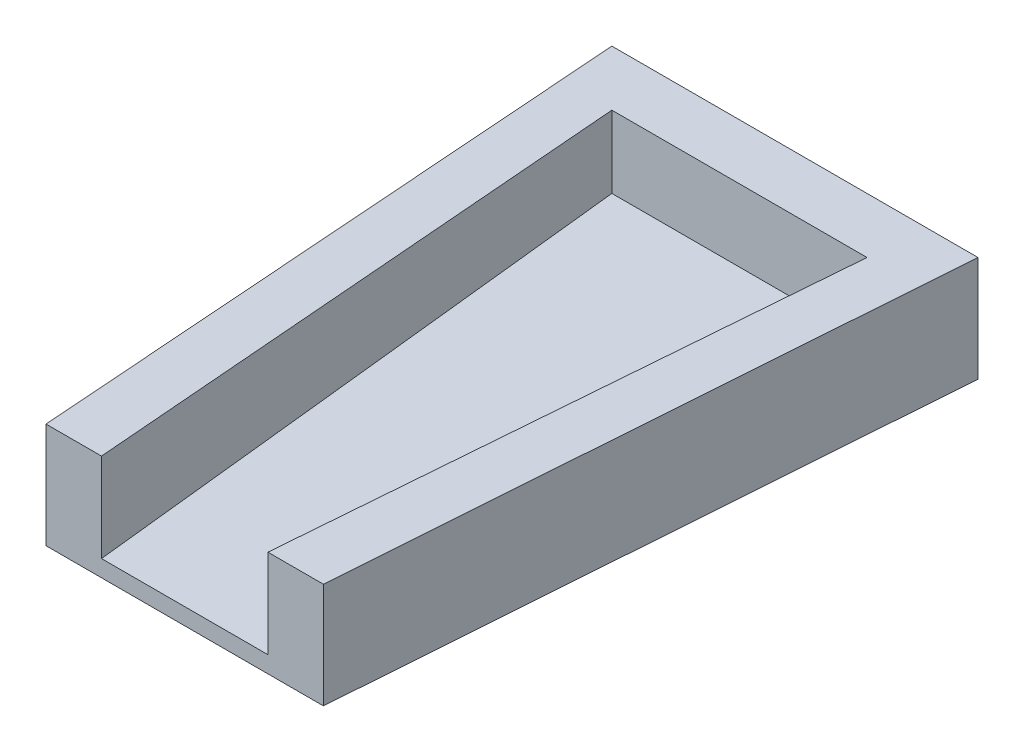
ISO-10303-21;
HEADER;
FILE_DESCRIPTION(('STEP AP214'),'2;1');
FILE_NAME('part.step','',(''),(''),'','','');
FILE_SCHEMA(('AUTOMOTIVE_DESIGN { 1 0 10303 214 1 1 1 1 }'));
ENDSEC;
DATA;
#1=APPLICATION_CONTEXT('core data for automotive mechanical design processes');
#2=APPLICATION_PROTOCOL_DEFINITION('international standard','automotive_design',2000,#1);
#3=PRODUCT_CONTEXT('',#1,'mechanical');
#4=PRODUCT('Part','Part','',(#3));
#5=PRODUCT_RELATED_PRODUCT_CATEGORY('part','',(#4));
#6=PRODUCT_DEFINITION_FORMATION('','',#4);
#7=PRODUCT_DEFINITION_CONTEXT('part definition',#1,'design');
#8=PRODUCT_DEFINITION('design','',#6,#7);
#9=PRODUCT_DEFINITION_SHAPE('','',#8);
#10=(LENGTH_UNIT() NAMED_UNIT(*) SI_UNIT(.MILLI.,.METRE.));
#11=(NAMED_UNIT(*) PLANE_ANGLE_UNIT() SI_UNIT($,.RADIAN.));
#12=(NAMED_UNIT(*) SI_UNIT($,.STERADIAN.) SOLID_ANGLE_UNIT());
#13=UNCERTAINTY_MEASURE_WITH_UNIT(LENGTH_MEASURE(1.E-05),#10,'distance_accuracy_value','');
#14=(GEOMETRIC_REPRESENTATION_CONTEXT(3) GLOBAL_UNCERTAINTY_ASSIGNED_CONTEXT((#13)) GLOBAL_UNIT_ASSIGNED_CONTEXT((#10,
#11,#12)) REPRESENTATION_CONTEXT('',''));
#15=CARTESIAN_POINT('',(0.,0.,0.));
#16=DIRECTION('',(0.,0.,1.));
#17=DIRECTION('',(1.,0.,0.));
#18=AXIS2_PLACEMENT_3D('',#15,#16,#17);
#19=CARTESIAN_POINT('',(0.,0.,11.));
#20=DIRECTION('',(0.,0.,-1.));
#21=DIRECTION('',(-1.,0.,0.));
#22=AXIS2_PLACEMENT_3D('',#19,#20,#21);
#23=PLANE('',#22);
#24=DIRECTION('',(-1.,0.,0.));
#25=VECTOR('',#24,1.);
#26=CARTESIAN_POINT('',(0.,0.,11.));
#27=LINE('',#26,#25);
#28=CARTESIAN_POINT('',(2.5,0.,11.));
#29=VERTEX_POINT('',#28);
#30=CARTESIAN_POINT('',(1.5,0.,11.));
#31=VERTEX_POINT('',#30);
#32=EDGE_CURVE('E157',#29,#31,#27,.T.);
#33=ORIENTED_EDGE('',*,*,#32,.T.);
#34=DIRECTION('',(0.,1.,0.));
#35=VECTOR('',#34,1.);
#36=CARTESIAN_POINT('',(1.5,-1.6,11.));
#37=LINE('',#36,#35);
#38=CARTESIAN_POINT('',(1.5,-1.6,11.));
#39=VERTEX_POINT('',#38);
#40=EDGE_CURVE('E132',#39,#31,#37,.T.);
#41=ORIENTED_EDGE('',*,*,#40,.F.);
#42=DIRECTION('',(1.,0.,0.));
#43=VECTOR('',#42,1.);
#44=CARTESIAN_POINT('',(-1.5,-1.6,11.));
#45=LINE('',#44,#43);
#46=CARTESIAN_POINT('',(-1.5,-1.6,11.));
#47=VERTEX_POINT('',#46);
#48=EDGE_CURVE('E131',#47,#39,#45,.T.);
#49=ORIENTED_EDGE('',*,*,#48,.F.);
#50=DIRECTION('',(0.,-1.,0.));
#51=VECTOR('',#50,1.);
#52=CARTESIAN_POINT('',(-1.5,-1.6,11.));
#53=LINE('',#52,#51);
#54=CARTESIAN_POINT('',(-1.5,0.,11.));
#55=VERTEX_POINT('',#54);
#56=EDGE_CURVE('E122',#55,#47,#53,.T.);
#57=ORIENTED_EDGE('',*,*,#56,.F.);
#58=CARTESIAN_POINT('',(-2.5,0.,11.));
#59=VERTEX_POINT('',#58);
#60=EDGE_CURVE('E164',#55,#59,#27,.T.);
#61=ORIENTED_EDGE('',*,*,#60,.T.);
#62=DIRECTION('',(0.,-1.,0.));
#63=VECTOR('',#62,1.);
#64=CARTESIAN_POINT('',(-2.5,-1.9,11.));
#65=LINE('',#64,#63);
#66=CARTESIAN_POINT('',(-2.5,-1.9,11.));
#67=VERTEX_POINT('',#66);
#68=EDGE_CURVE('E294',#59,#67,#65,.T.);
#69=ORIENTED_EDGE('',*,*,#68,.T.);
#70=DIRECTION('',(1.,0.,0.));
#71=VECTOR('',#70,1.);
#72=CARTESIAN_POINT('',(-2.5,-1.9,11.));
#73=LINE('',#72,#71);
#74=CARTESIAN_POINT('',(2.5,-1.9,11.));
#75=VERTEX_POINT('',#74);
#76=EDGE_CURVE('E290',#67,#75,#73,.T.);
#77=ORIENTED_EDGE('',*,*,#76,.T.);
#78=DIRECTION('',(0.,1.,0.));
#79=VECTOR('',#78,1.);
#80=CARTESIAN_POINT('',(2.5,-1.9,11.));
#81=LINE('',#80,#79);
#82=EDGE_CURVE('E161',#75,#29,#81,.T.);
#83=ORIENTED_EDGE('',*,*,#82,.T.);
#84=EDGE_LOOP('',(#33,#41,#49,#57,#61,#69,#77,#83));
#85=FACE_BOUND('',#84,.T.);
#86=ADVANCED_FACE('F55',(#85),#23,.F.);
#87=CARTESIAN_POINT('',(0.,0.,0.));
#88=DIRECTION('',(0.,0.,-1.));
#89=DIRECTION('',(-1.,0.,0.));
#90=AXIS2_PLACEMENT_3D('',#87,#88,#89);
#91=PLANE('',#90);
#92=DIRECTION('',(-1.,0.,0.));
#93=VECTOR('',#92,1.);
#94=CARTESIAN_POINT('',(0.,0.,0.));
#95=LINE('',#94,#93);
#96=CARTESIAN_POINT('',(3.3,0.,0.));
#97=VERTEX_POINT('',#96);
#98=CARTESIAN_POINT('',(-3.3,0.,0.));
#99=VERTEX_POINT('',#98);
#100=EDGE_CURVE('E81',#97,#99,#95,.T.);
#101=ORIENTED_EDGE('',*,*,#100,.F.);
#102=DIRECTION('',(0.,1.,0.));
#103=VECTOR('',#102,1.);
#104=CARTESIAN_POINT('',(3.3,-1.9,0.));
#105=LINE('',#104,#103);
#106=CARTESIAN_POINT('',(3.3,-1.9,0.));
#107=VERTEX_POINT('',#106);
#108=EDGE_CURVE('E166',#107,#97,#105,.T.);
#109=ORIENTED_EDGE('',*,*,#108,.F.);
#110=DIRECTION('',(1.,0.,0.));
#111=VECTOR('',#110,1.);
#112=CARTESIAN_POINT('',(-3.3,-1.9,0.));
#113=LINE('',#112,#111);
#114=CARTESIAN_POINT('',(-3.3,-1.9,0.));
#115=VERTEX_POINT('',#114);
#116=EDGE_CURVE('E273',#115,#107,#113,.T.);
#117=ORIENTED_EDGE('',*,*,#116,.F.);
#118=DIRECTION('',(0.,-1.,0.));
#119=VECTOR('',#118,1.);
#120=CARTESIAN_POINT('',(-3.3,-1.9,0.));
#121=LINE('',#120,#119);
#122=EDGE_CURVE('E286',#99,#115,#121,.T.);
#123=ORIENTED_EDGE('',*,*,#122,.F.);
#124=EDGE_LOOP('',(#101,#109,#117,#123));
#125=FACE_BOUND('',#124,.T.);
#126=ADVANCED_FACE('F252',(#125),#91,.T.);
#127=CARTESIAN_POINT('',(3.28263729036501,0.,0.238737257481092));
#128=DIRECTION('',(-0.997365816958794,0.,-0.0725356957788214));
#129=DIRECTION('',(-0.0725356957788214,0.,0.997365816958794));
#130=AXIS2_PLACEMENT_3D('',#127,#128,#129);
#131=PLANE('',#130);
#132=ORIENTED_EDGE('',*,*,#108,.T.);
#133=DIRECTION('',(-0.0725356957788214,0.,0.997365816958794));
#134=VECTOR('',#133,1.);
#135=CARTESIAN_POINT('',(3.28263729036501,0.,0.238737257481092));
#136=LINE('',#135,#134);
#137=EDGE_CURVE('E163',#97,#29,#136,.T.);
#138=ORIENTED_EDGE('',*,*,#137,.T.);
#139=ORIENTED_EDGE('',*,*,#82,.F.);
#140=DIRECTION('',(-0.0725356957788214,0.,0.997365816958794));
#141=VECTOR('',#140,1.);
#142=CARTESIAN_POINT('',(3.3,-1.9,0.));
#143=LINE('',#142,#141);
#144=EDGE_CURVE('E371',#107,#75,#143,.T.);
#145=ORIENTED_EDGE('',*,*,#144,.F.);
#146=EDGE_LOOP('',(#132,#138,#139,#145));
#147=FACE_BOUND('',#146,.T.);
#148=ADVANCED_FACE('F256',(#147),#131,.F.);
#149=CARTESIAN_POINT('',(-3.28263729036501,0.,0.238737257481092));
#150=DIRECTION('',(0.997365816958794,0.,-0.0725356957788214));
#151=DIRECTION('',(-0.0725356957788214,0.,-0.997365816958794));
#152=AXIS2_PLACEMENT_3D('',#149,#150,#151);
#153=PLANE('',#152);
#154=ORIENTED_EDGE('',*,*,#68,.F.);
#155=DIRECTION('',(-0.0725356957788214,0.,-0.997365816958794));
#156=VECTOR('',#155,1.);
#157=CARTESIAN_POINT('',(-3.28263729036501,0.,0.238737257481092));
#158=LINE('',#157,#156);
#159=EDGE_CURVE('E181',#59,#99,#158,.T.);
#160=ORIENTED_EDGE('',*,*,#159,.T.);
#161=ORIENTED_EDGE('',*,*,#122,.T.);
#162=DIRECTION('',(0.0725356957788214,0.,0.997365816958794));
#163=VECTOR('',#162,1.);
#164=CARTESIAN_POINT('',(-3.3,-1.9,0.));
#165=LINE('',#164,#163);
#166=EDGE_CURVE('E374',#115,#67,#165,.T.);
#167=ORIENTED_EDGE('',*,*,#166,.T.);
#168=EDGE_LOOP('',(#154,#160,#161,#167));
#169=FACE_BOUND('',#168,.T.);
#170=ADVANCED_FACE('F336',(#169),#153,.F.);
#171=CARTESIAN_POINT('',(0.,-1.9,0.));
#172=DIRECTION('',(0.,1.,0.));
#173=DIRECTION('',(0.,0.,1.));
#174=AXIS2_PLACEMENT_3D('',#171,#172,#173);
#175=PLANE('',#174);
#176=ORIENTED_EDGE('',*,*,#144,.T.);
#177=ORIENTED_EDGE('',*,*,#76,.F.);
#178=ORIENTED_EDGE('',*,*,#166,.F.);
#179=ORIENTED_EDGE('',*,*,#116,.T.);
#180=EDGE_LOOP('',(#176,#177,#178,#179));
#181=FACE_BOUND('',#180,.T.);
#182=ADVANCED_FACE('F251',(#181),#175,.F.);
#183=CARTESIAN_POINT('',(-4.36182031470955,0.,-0.000100000000000054));
#184=DIRECTION('',(0.,-1.,0.));
#185=DIRECTION('',(0.,0.,-1.));
#186=AXIS2_PLACEMENT_3D('',#183,#184,#185);
#187=PLANE('',#186);
#188=DIRECTION('',(-1.,0.,0.));
#189=VECTOR('',#188,1.);
#190=CARTESIAN_POINT('',(-4.36182031470955,0.,1.));
#191=LINE('',#190,#189);
#192=CARTESIAN_POINT('',(2.3,0.,1.));
#193=VERTEX_POINT('',#192);
#194=CARTESIAN_POINT('',(-2.3,0.,1.));
#195=VERTEX_POINT('',#194);
#196=EDGE_CURVE('E64',#193,#195,#191,.T.);
#197=ORIENTED_EDGE('',*,*,#196,.F.);
#198=DIRECTION('',(-0.07974522228289,0.,0.996815278536125));
#199=VECTOR('',#198,1.);
#200=CARTESIAN_POINT('',(2.33713468798277,0.,0.535816400215386));
#201=LINE('',#200,#199);
#202=EDGE_CURVE('E12',#193,#31,#201,.T.);
#203=ORIENTED_EDGE('',*,*,#202,.T.);
#204=ORIENTED_EDGE('',*,*,#32,.F.);
#205=ORIENTED_EDGE('',*,*,#137,.F.);
#206=ORIENTED_EDGE('',*,*,#100,.T.);
#207=ORIENTED_EDGE('',*,*,#159,.F.);
#208=ORIENTED_EDGE('',*,*,#60,.F.);
#209=DIRECTION('',(-0.0797452222828899,0.,-0.996815278536125));
#210=VECTOR('',#209,1.);
#211=CARTESIAN_POINT('',(-2.39261093999815,0.,-0.157636749976912));
#212=LINE('',#211,#210);
#213=EDGE_CURVE('E127',#55,#195,#212,.T.);
#214=ORIENTED_EDGE('',*,*,#213,.T.);
#215=EDGE_LOOP('',(#197,#203,#204,#205,#206,#207,#208,#214));
#216=FACE_BOUND('',#215,.T.);
#217=ADVANCED_FACE('F156',(#216),#187,.F.);
#218=CARTESIAN_POINT('',(0.,0.,1.));
#219=DIRECTION('',(0.,0.,1.));
#220=DIRECTION('',(1.,0.,0.));
#221=AXIS2_PLACEMENT_3D('',#218,#219,#220);
#222=PLANE('',#221);
#223=ORIENTED_EDGE('',*,*,#196,.T.);
#224=DIRECTION('',(0.,-1.,0.));
#225=VECTOR('',#224,1.);
#226=CARTESIAN_POINT('',(-2.3,-1.3,1.));
#227=LINE('',#226,#225);
#228=CARTESIAN_POINT('',(-2.3,-1.3,1.));
#229=VERTEX_POINT('',#228);
#230=EDGE_CURVE('E72',#195,#229,#227,.T.);
#231=ORIENTED_EDGE('',*,*,#230,.T.);
#232=DIRECTION('',(1.,0.,0.));
#233=VECTOR('',#232,1.);
#234=CARTESIAN_POINT('',(2.3,-1.3,1.));
#235=LINE('',#234,#233);
#236=CARTESIAN_POINT('',(2.3,-1.3,1.));
#237=VERTEX_POINT('',#236);
#238=EDGE_CURVE('E139',#229,#237,#235,.T.);
#239=ORIENTED_EDGE('',*,*,#238,.T.);
#240=DIRECTION('',(0.,1.,0.));
#241=VECTOR('',#240,1.);
#242=CARTESIAN_POINT('',(2.3,-1.3,1.));
#243=LINE('',#242,#241);
#244=EDGE_CURVE('E191',#237,#193,#243,.T.);
#245=ORIENTED_EDGE('',*,*,#244,.T.);
#246=EDGE_LOOP('',(#223,#231,#239,#245));
#247=FACE_BOUND('',#246,.T.);
#248=ADVANCED_FACE('F211',(#247),#222,.T.);
#249=CARTESIAN_POINT('',(2.36486486486486,0.,0.189189189189189));
#250=DIRECTION('',(0.996815278536125,0.,0.07974522228289));
#251=DIRECTION('',(0.07974522228289,0.,-0.996815278536125));
#252=AXIS2_PLACEMENT_3D('',#249,#250,#251);
#253=PLANE('',#252);
#254=ORIENTED_EDGE('',*,*,#244,.F.);
#255=DIRECTION('',(0.0797095890362908,0.029891095888609,-0.996369862953634));
#256=VECTOR('',#255,1.);
#257=CARTESIAN_POINT('',(1.5,-1.6,11.));
#258=LINE('',#257,#256);
#259=EDGE_CURVE('E141',#39,#237,#258,.T.);
#260=ORIENTED_EDGE('',*,*,#259,.F.);
#261=ORIENTED_EDGE('',*,*,#40,.T.);
#262=ORIENTED_EDGE('',*,*,#202,.F.);
#263=EDGE_LOOP('',(#254,#260,#261,#262));
#264=FACE_BOUND('',#263,.T.);
#265=ADVANCED_FACE('F153',(#264),#253,.F.);
#266=CARTESIAN_POINT('',(-2.36486486486486,0.,0.189189189189189));
#267=DIRECTION('',(-0.996815278536125,0.,0.0797452222828899));
#268=DIRECTION('',(0.0797452222828899,0.,0.996815278536125));
#269=AXIS2_PLACEMENT_3D('',#266,#267,#268);
#270=PLANE('',#269);
#271=ORIENTED_EDGE('',*,*,#56,.T.);
#272=DIRECTION('',(-0.0797095890362907,0.029891095888609,-0.996369862953634));
#273=VECTOR('',#272,1.);
#274=CARTESIAN_POINT('',(-1.5,-1.6,11.));
#275=LINE('',#274,#273);
#276=EDGE_CURVE('E125',#47,#229,#275,.T.);
#277=ORIENTED_EDGE('',*,*,#276,.T.);
#278=ORIENTED_EDGE('',*,*,#230,.F.);
#279=ORIENTED_EDGE('',*,*,#213,.F.);
#280=EDGE_LOOP('',(#271,#277,#278,#279));
#281=FACE_BOUND('',#280,.T.);
#282=ADVANCED_FACE('F124',(#281),#270,.F.);
#283=CARTESIAN_POINT('',(0.,-1.268858027775,-0.03806574083325));
#284=DIRECTION('',(0.,-0.999550303522367,-0.0299865091056709));
#285=DIRECTION('',(0.,0.0299865091056709,-0.999550303522367));
#286=AXIS2_PLACEMENT_3D('',#283,#284,#285);
#287=PLANE('',#286);
#288=ORIENTED_EDGE('',*,*,#276,.F.);
#289=ORIENTED_EDGE('',*,*,#48,.T.);
#290=ORIENTED_EDGE('',*,*,#259,.T.);
#291=ORIENTED_EDGE('',*,*,#238,.F.);
#292=EDGE_LOOP('',(#288,#289,#290,#291));
#293=FACE_BOUND('',#292,.T.);
#294=ADVANCED_FACE('F136',(#293),#287,.F.);
#295=CLOSED_SHELL('',(#86,#126,#148,#170,#182,#217,#248,#265,#282,#294));
#296=MANIFOLD_SOLID_BREP('B2',#295);
#297=ADVANCED_BREP_SHAPE_REPRESENTATION('',(#18,#296),#14);
#298=SHAPE_DEFINITION_REPRESENTATION(#9,#297);
ENDSEC;
END-ISO-10303-21;
